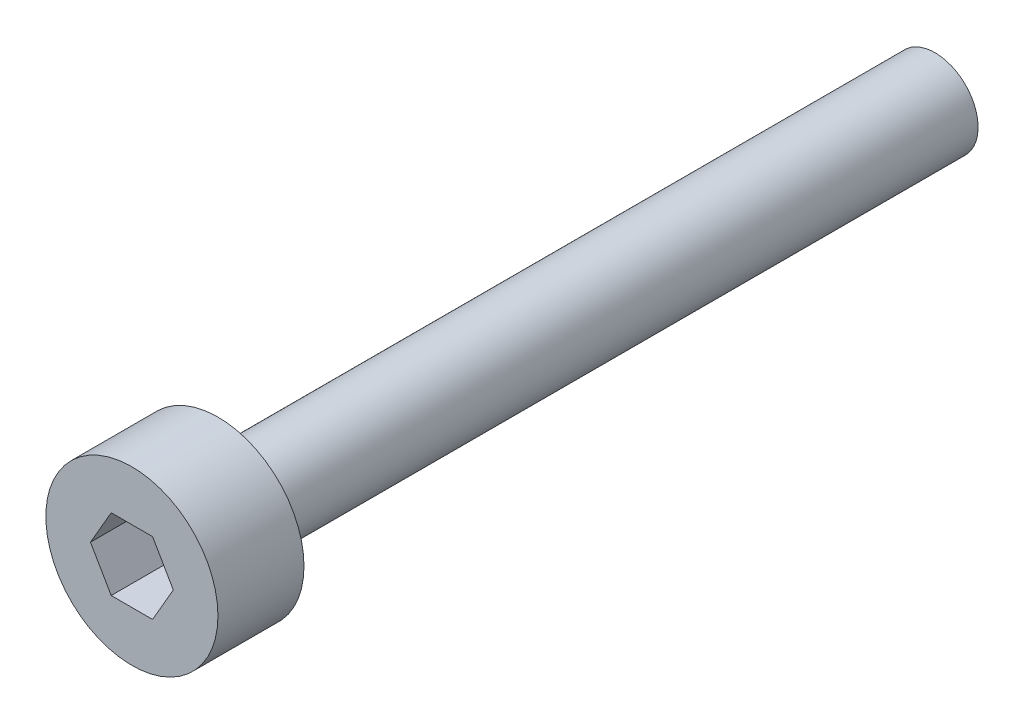
ISO-10303-21;
HEADER;
FILE_DESCRIPTION(('STEP AP214'),'2;1');
FILE_NAME('part.step','',(''),(''),'','','');
FILE_SCHEMA(('AUTOMOTIVE_DESIGN { 1 0 10303 214 1 1 1 1 }'));
ENDSEC;
DATA;
#1=APPLICATION_CONTEXT('core data for automotive mechanical design processes');
#2=APPLICATION_PROTOCOL_DEFINITION('international standard','automotive_design',2000,#1);
#3=PRODUCT_CONTEXT('',#1,'mechanical');
#4=PRODUCT('Part','Part','',(#3));
#5=PRODUCT_RELATED_PRODUCT_CATEGORY('part','',(#4));
#6=PRODUCT_DEFINITION_FORMATION('','',#4);
#7=PRODUCT_DEFINITION_CONTEXT('part definition',#1,'design');
#8=PRODUCT_DEFINITION('design','',#6,#7);
#9=PRODUCT_DEFINITION_SHAPE('','',#8);
#10=(LENGTH_UNIT() NAMED_UNIT(*) SI_UNIT(.MILLI.,.METRE.));
#11=(NAMED_UNIT(*) PLANE_ANGLE_UNIT() SI_UNIT($,.RADIAN.));
#12=(NAMED_UNIT(*) SI_UNIT($,.STERADIAN.) SOLID_ANGLE_UNIT());
#13=UNCERTAINTY_MEASURE_WITH_UNIT(LENGTH_MEASURE(1.E-05),#10,'distance_accuracy_value','');
#14=(GEOMETRIC_REPRESENTATION_CONTEXT(3) GLOBAL_UNCERTAINTY_ASSIGNED_CONTEXT((#13)) GLOBAL_UNIT_ASSIGNED_CONTEXT((#10,
#11,#12)) REPRESENTATION_CONTEXT('',''));
#15=CARTESIAN_POINT('',(0.,0.,0.));
#16=DIRECTION('',(0.,0.,1.));
#17=DIRECTION('',(1.,0.,0.));
#18=AXIS2_PLACEMENT_3D('',#15,#16,#17);
#19=CARTESIAN_POINT('',(0.,0.,3.));
#20=DIRECTION('',(0.,0.,-1.));
#21=DIRECTION('',(-1.,0.,0.));
#22=AXIS2_PLACEMENT_3D('',#19,#20,#21);
#23=CYLINDRICAL_SURFACE('',#22,3.);
#24=CARTESIAN_POINT('',(0.,0.,3.));
#25=DIRECTION('',(0.,0.,1.));
#26=DIRECTION('',(1.,0.,0.));
#27=AXIS2_PLACEMENT_3D('',#24,#25,#26);
#28=CIRCLE('',#27,3.);
#29=CARTESIAN_POINT('',(3.,0.,3.));
#30=VERTEX_POINT('',#29);
#31=EDGE_CURVE('E54',#30,#30,#28,.T.);
#32=ORIENTED_EDGE('',*,*,#31,.F.);
#33=EDGE_LOOP('',(#32));
#34=FACE_BOUND('',#33,.T.);
#35=CARTESIAN_POINT('',(0.,0.,0.));
#36=DIRECTION('',(0.,0.,1.));
#37=DIRECTION('',(1.,0.,0.));
#38=AXIS2_PLACEMENT_3D('',#35,#36,#37);
#39=CIRCLE('',#38,3.);
#40=CARTESIAN_POINT('',(3.,0.,0.));
#41=VERTEX_POINT('',#40);
#42=EDGE_CURVE('E48',#41,#41,#39,.T.);
#43=ORIENTED_EDGE('',*,*,#42,.T.);
#44=EDGE_LOOP('',(#43));
#45=FACE_BOUND('',#44,.T.);
#46=ADVANCED_FACE('F45',(#34,#45),#23,.T.);
#47=CARTESIAN_POINT('',(0.,0.,3.));
#48=DIRECTION('',(0.,0.,1.));
#49=DIRECTION('',(1.,0.,0.));
#50=AXIS2_PLACEMENT_3D('',#47,#48,#49);
#51=PLANE('',#50);
#52=DIRECTION('',(0.5,0.866025403784439,0.));
#53=VECTOR('',#52,1.);
#54=CARTESIAN_POINT('',(0.721687836487033,-1.25,3.));
#55=LINE('',#54,#53);
#56=CARTESIAN_POINT('',(0.721687836487033,-1.25,3.));
#57=VERTEX_POINT('',#56);
#58=CARTESIAN_POINT('',(1.44337567297407,0.,3.));
#59=VERTEX_POINT('',#58);
#60=EDGE_CURVE('E62',#57,#59,#55,.T.);
#61=ORIENTED_EDGE('',*,*,#60,.F.);
#62=DIRECTION('',(1.,0.,0.));
#63=VECTOR('',#62,1.);
#64=CARTESIAN_POINT('',(-0.721687836487031,-1.25,3.));
#65=LINE('',#64,#63);
#66=CARTESIAN_POINT('',(-0.721687836487031,-1.25,3.));
#67=VERTEX_POINT('',#66);
#68=EDGE_CURVE('E156',#67,#57,#65,.T.);
#69=ORIENTED_EDGE('',*,*,#68,.F.);
#70=DIRECTION('',(0.5,-0.866025403784438,0.));
#71=VECTOR('',#70,1.);
#72=CARTESIAN_POINT('',(-1.44337567297406,0.,3.));
#73=LINE('',#72,#71);
#74=CARTESIAN_POINT('',(-1.44337567297406,0.,3.));
#75=VERTEX_POINT('',#74);
#76=EDGE_CURVE('E153',#75,#67,#73,.T.);
#77=ORIENTED_EDGE('',*,*,#76,.F.);
#78=DIRECTION('',(-0.5,-0.866025403784439,0.));
#79=VECTOR('',#78,1.);
#80=CARTESIAN_POINT('',(-0.721687836487032,1.25,3.));
#81=LINE('',#80,#79);
#82=CARTESIAN_POINT('',(-0.721687836487032,1.25,3.));
#83=VERTEX_POINT('',#82);
#84=EDGE_CURVE('E110',#83,#75,#81,.T.);
#85=ORIENTED_EDGE('',*,*,#84,.F.);
#86=DIRECTION('',(-1.,0.,0.));
#87=VECTOR('',#86,1.);
#88=CARTESIAN_POINT('',(0.721687836487032,1.25,3.));
#89=LINE('',#88,#87);
#90=CARTESIAN_POINT('',(0.721687836487032,1.25,3.));
#91=VERTEX_POINT('',#90);
#92=EDGE_CURVE('E147',#91,#83,#89,.T.);
#93=ORIENTED_EDGE('',*,*,#92,.F.);
#94=DIRECTION('',(-0.5,0.866025403784438,0.));
#95=VECTOR('',#94,1.);
#96=CARTESIAN_POINT('',(1.44337567297406,0.,3.));
#97=LINE('',#96,#95);
#98=EDGE_CURVE('E142',#59,#91,#97,.T.);
#99=ORIENTED_EDGE('',*,*,#98,.F.);
#100=EDGE_LOOP('',(#61,#69,#77,#85,#93,#99));
#101=FACE_BOUND('',#100,.T.);
#102=ORIENTED_EDGE('',*,*,#31,.T.);
#103=EDGE_LOOP('',(#102));
#104=FACE_BOUND('',#103,.T.);
#105=ADVANCED_FACE('F182',(#101,#104),#51,.T.);
#106=CARTESIAN_POINT('',(0.,0.,0.));
#107=DIRECTION('',(0.,0.,1.));
#108=DIRECTION('',(1.,0.,0.));
#109=AXIS2_PLACEMENT_3D('',#106,#107,#108);
#110=PLANE('',#109);
#111=CARTESIAN_POINT('',(0.,0.,0.));
#112=DIRECTION('',(0.,0.,-1.));
#113=DIRECTION('',(-1.,0.,0.));
#114=AXIS2_PLACEMENT_3D('',#111,#112,#113);
#115=CIRCLE('',#114,1.5);
#116=CARTESIAN_POINT('',(-1.5,0.,0.));
#117=VERTEX_POINT('',#116);
#118=EDGE_CURVE('E11',#117,#117,#115,.T.);
#119=ORIENTED_EDGE('',*,*,#118,.F.);
#120=EDGE_LOOP('',(#119));
#121=FACE_BOUND('',#120,.T.);
#122=ORIENTED_EDGE('',*,*,#42,.F.);
#123=EDGE_LOOP('',(#122));
#124=FACE_BOUND('',#123,.T.);
#125=ADVANCED_FACE('F179',(#121,#124),#110,.F.);
#126=CARTESIAN_POINT('',(0.721687836487033,-1.25,1.));
#127=DIRECTION('',(0.866025403784439,-0.5,0.));
#128=DIRECTION('',(0.5,0.866025403784439,0.));
#129=AXIS2_PLACEMENT_3D('',#126,#127,#128);
#130=PLANE('',#129);
#131=ORIENTED_EDGE('',*,*,#60,.T.);
#132=DIRECTION('',(0.,0.,1.));
#133=VECTOR('',#132,1.);
#134=CARTESIAN_POINT('',(1.44337567297406,0.,1.));
#135=LINE('',#134,#133);
#136=CARTESIAN_POINT('',(1.44337567297406,0.,1.));
#137=VERTEX_POINT('',#136);
#138=EDGE_CURVE('E92',#137,#59,#135,.T.);
#139=ORIENTED_EDGE('',*,*,#138,.F.);
#140=DIRECTION('',(0.5,0.866025403784439,0.));
#141=VECTOR('',#140,1.);
#142=CARTESIAN_POINT('',(0.721687836487033,-1.25,1.));
#143=LINE('',#142,#141);
#144=CARTESIAN_POINT('',(0.721687836487033,-1.25,1.));
#145=VERTEX_POINT('',#144);
#146=EDGE_CURVE('E159',#145,#137,#143,.T.);
#147=ORIENTED_EDGE('',*,*,#146,.F.);
#148=DIRECTION('',(0.,0.,1.));
#149=VECTOR('',#148,1.);
#150=CARTESIAN_POINT('',(0.721687836487033,-1.25,1.));
#151=LINE('',#150,#149);
#152=EDGE_CURVE('E70',#145,#57,#151,.T.);
#153=ORIENTED_EDGE('',*,*,#152,.T.);
#154=EDGE_LOOP('',(#131,#139,#147,#153));
#155=FACE_BOUND('',#154,.T.);
#156=ADVANCED_FACE('F181',(#155),#130,.F.);
#157=CARTESIAN_POINT('',(-0.721687836487031,-1.25,1.));
#158=DIRECTION('',(0.,-1.,0.));
#159=DIRECTION('',(0.,0.,-1.));
#160=AXIS2_PLACEMENT_3D('',#157,#158,#159);
#161=PLANE('',#160);
#162=ORIENTED_EDGE('',*,*,#68,.T.);
#163=ORIENTED_EDGE('',*,*,#152,.F.);
#164=DIRECTION('',(1.,0.,0.));
#165=VECTOR('',#164,1.);
#166=CARTESIAN_POINT('',(-0.721687836487031,-1.25,1.));
#167=LINE('',#166,#165);
#168=CARTESIAN_POINT('',(-0.721687836487031,-1.25,1.));
#169=VERTEX_POINT('',#168);
#170=EDGE_CURVE('E124',#169,#145,#167,.T.);
#171=ORIENTED_EDGE('',*,*,#170,.F.);
#172=DIRECTION('',(0.,0.,1.));
#173=VECTOR('',#172,1.);
#174=CARTESIAN_POINT('',(-0.721687836487031,-1.25,1.));
#175=LINE('',#174,#173);
#176=EDGE_CURVE('E115',#169,#67,#175,.T.);
#177=ORIENTED_EDGE('',*,*,#176,.T.);
#178=EDGE_LOOP('',(#162,#163,#171,#177));
#179=FACE_BOUND('',#178,.T.);
#180=ADVANCED_FACE('F189',(#179),#161,.F.);
#181=CARTESIAN_POINT('',(-1.44337567297406,0.,1.));
#182=DIRECTION('',(-0.866025403784438,-0.5,0.));
#183=DIRECTION('',(0.5,-0.866025403784438,0.));
#184=AXIS2_PLACEMENT_3D('',#181,#182,#183);
#185=PLANE('',#184);
#186=ORIENTED_EDGE('',*,*,#76,.T.);
#187=ORIENTED_EDGE('',*,*,#176,.F.);
#188=DIRECTION('',(0.5,-0.866025403784438,0.));
#189=VECTOR('',#188,1.);
#190=CARTESIAN_POINT('',(-1.44337567297406,0.,1.));
#191=LINE('',#190,#189);
#192=CARTESIAN_POINT('',(-1.44337567297406,0.,1.));
#193=VERTEX_POINT('',#192);
#194=EDGE_CURVE('E119',#193,#169,#191,.T.);
#195=ORIENTED_EDGE('',*,*,#194,.F.);
#196=DIRECTION('',(0.,0.,1.));
#197=VECTOR('',#196,1.);
#198=CARTESIAN_POINT('',(-1.44337567297406,0.,1.));
#199=LINE('',#198,#197);
#200=EDGE_CURVE('E103',#193,#75,#199,.T.);
#201=ORIENTED_EDGE('',*,*,#200,.T.);
#202=EDGE_LOOP('',(#186,#187,#195,#201));
#203=FACE_BOUND('',#202,.T.);
#204=ADVANCED_FACE('F120',(#203),#185,.F.);
#205=CARTESIAN_POINT('',(-0.721687836487032,1.25,1.));
#206=DIRECTION('',(-0.866025403784439,0.5,0.));
#207=DIRECTION('',(-0.5,-0.866025403784439,0.));
#208=AXIS2_PLACEMENT_3D('',#205,#206,#207);
#209=PLANE('',#208);
#210=ORIENTED_EDGE('',*,*,#84,.T.);
#211=ORIENTED_EDGE('',*,*,#200,.F.);
#212=DIRECTION('',(-0.5,-0.866025403784439,0.));
#213=VECTOR('',#212,1.);
#214=CARTESIAN_POINT('',(-0.721687836487032,1.25,1.));
#215=LINE('',#214,#213);
#216=CARTESIAN_POINT('',(-0.721687836487032,1.25,1.));
#217=VERTEX_POINT('',#216);
#218=EDGE_CURVE('E107',#217,#193,#215,.T.);
#219=ORIENTED_EDGE('',*,*,#218,.F.);
#220=DIRECTION('',(0.,0.,1.));
#221=VECTOR('',#220,1.);
#222=CARTESIAN_POINT('',(-0.721687836487032,1.25,1.));
#223=LINE('',#222,#221);
#224=EDGE_CURVE('E116',#217,#83,#223,.T.);
#225=ORIENTED_EDGE('',*,*,#224,.T.);
#226=EDGE_LOOP('',(#210,#211,#219,#225));
#227=FACE_BOUND('',#226,.T.);
#228=ADVANCED_FACE('F105',(#227),#209,.F.);
#229=CARTESIAN_POINT('',(0.721687836487032,1.25,1.));
#230=DIRECTION('',(0.,1.,0.));
#231=DIRECTION('',(0.,0.,1.));
#232=AXIS2_PLACEMENT_3D('',#229,#230,#231);
#233=PLANE('',#232);
#234=ORIENTED_EDGE('',*,*,#92,.T.);
#235=ORIENTED_EDGE('',*,*,#224,.F.);
#236=DIRECTION('',(-1.,0.,0.));
#237=VECTOR('',#236,1.);
#238=CARTESIAN_POINT('',(0.721687836487032,1.25,1.));
#239=LINE('',#238,#237);
#240=CARTESIAN_POINT('',(0.721687836487032,1.25,1.));
#241=VERTEX_POINT('',#240);
#242=EDGE_CURVE('E130',#241,#217,#239,.T.);
#243=ORIENTED_EDGE('',*,*,#242,.F.);
#244=DIRECTION('',(0.,0.,1.));
#245=VECTOR('',#244,1.);
#246=CARTESIAN_POINT('',(0.721687836487032,1.25,1.));
#247=LINE('',#246,#245);
#248=EDGE_CURVE('E166',#241,#91,#247,.T.);
#249=ORIENTED_EDGE('',*,*,#248,.T.);
#250=EDGE_LOOP('',(#234,#235,#243,#249));
#251=FACE_BOUND('',#250,.T.);
#252=ADVANCED_FACE('F230',(#251),#233,.F.);
#253=CARTESIAN_POINT('',(1.44337567297406,0.,1.));
#254=DIRECTION('',(0.866025403784438,0.5,0.));
#255=DIRECTION('',(-0.5,0.866025403784438,0.));
#256=AXIS2_PLACEMENT_3D('',#253,#254,#255);
#257=PLANE('',#256);
#258=ORIENTED_EDGE('',*,*,#98,.T.);
#259=ORIENTED_EDGE('',*,*,#248,.F.);
#260=DIRECTION('',(-0.5,0.866025403784438,0.));
#261=VECTOR('',#260,1.);
#262=CARTESIAN_POINT('',(1.44337567297406,0.,1.));
#263=LINE('',#262,#261);
#264=EDGE_CURVE('E134',#137,#241,#263,.T.);
#265=ORIENTED_EDGE('',*,*,#264,.F.);
#266=ORIENTED_EDGE('',*,*,#138,.T.);
#267=EDGE_LOOP('',(#258,#259,#265,#266));
#268=FACE_BOUND('',#267,.T.);
#269=ADVANCED_FACE('F238',(#268),#257,.F.);
#270=CARTESIAN_POINT('',(0.,0.,1.));
#271=DIRECTION('',(0.,0.,1.));
#272=DIRECTION('',(1.,0.,0.));
#273=AXIS2_PLACEMENT_3D('',#270,#271,#272);
#274=PLANE('',#273);
#275=ORIENTED_EDGE('',*,*,#146,.T.);
#276=ORIENTED_EDGE('',*,*,#264,.T.);
#277=ORIENTED_EDGE('',*,*,#242,.T.);
#278=ORIENTED_EDGE('',*,*,#218,.T.);
#279=ORIENTED_EDGE('',*,*,#194,.T.);
#280=ORIENTED_EDGE('',*,*,#170,.T.);
#281=EDGE_LOOP('',(#275,#276,#277,#278,#279,#280));
#282=FACE_BOUND('',#281,.T.);
#283=ADVANCED_FACE('F127',(#282),#274,.T.);
#284=CARTESIAN_POINT('',(0.,0.,-25.));
#285=DIRECTION('',(0.,0.,1.));
#286=DIRECTION('',(1.,0.,0.));
#287=AXIS2_PLACEMENT_3D('',#284,#285,#286);
#288=CYLINDRICAL_SURFACE('',#287,1.5);
#289=CARTESIAN_POINT('',(0.,0.,-25.));
#290=DIRECTION('',(0.,0.,-1.));
#291=DIRECTION('',(-1.,0.,0.));
#292=AXIS2_PLACEMENT_3D('',#289,#290,#291);
#293=CIRCLE('',#292,1.5);
#294=CARTESIAN_POINT('',(-1.5,0.,-25.));
#295=VERTEX_POINT('',#294);
#296=EDGE_CURVE('E143',#295,#295,#293,.T.);
#297=ORIENTED_EDGE('',*,*,#296,.F.);
#298=EDGE_LOOP('',(#297));
#299=FACE_BOUND('',#298,.T.);
#300=ORIENTED_EDGE('',*,*,#118,.T.);
#301=EDGE_LOOP('',(#300));
#302=FACE_BOUND('',#301,.T.);
#303=ADVANCED_FACE('F253',(#299,#302),#288,.T.);
#304=CARTESIAN_POINT('',(0.,0.,-25.));
#305=DIRECTION('',(0.,0.,-1.));
#306=DIRECTION('',(-1.,0.,0.));
#307=AXIS2_PLACEMENT_3D('',#304,#305,#306);
#308=PLANE('',#307);
#309=ORIENTED_EDGE('',*,*,#296,.T.);
#310=EDGE_LOOP('',(#309));
#311=FACE_BOUND('',#310,.T.);
#312=ADVANCED_FACE('F264',(#311),#308,.T.);
#313=CLOSED_SHELL('',(#46,#105,#125,#156,#180,#204,#228,#252,#269,#283,#303,#312));
#314=MANIFOLD_SOLID_BREP('B2',#313);
#315=ADVANCED_BREP_SHAPE_REPRESENTATION('',(#18,#314),#14);
#316=SHAPE_DEFINITION_REPRESENTATION(#9,#315);
ENDSEC;
END-ISO-10303-21;
